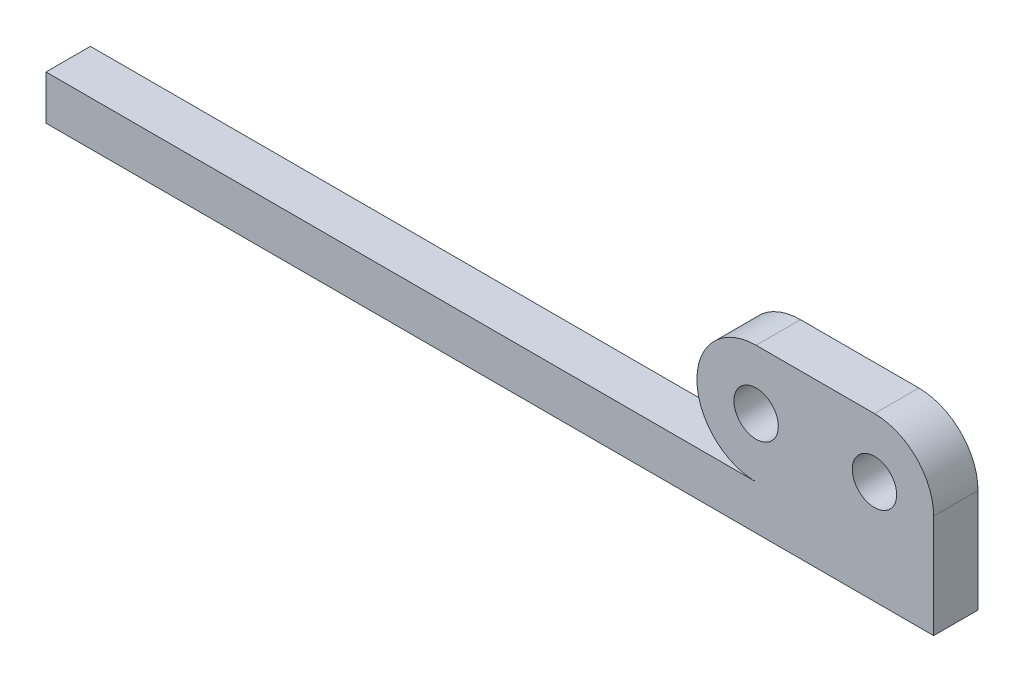
ISO-10303-21;
HEADER;
FILE_DESCRIPTION(('STEP AP214'),'2;1');
FILE_NAME('part.step','',(''),(''),'','','');
FILE_SCHEMA(('AUTOMOTIVE_DESIGN { 1 0 10303 214 1 1 1 1 }'));
ENDSEC;
DATA;
#1=APPLICATION_CONTEXT('core data for automotive mechanical design processes');
#2=APPLICATION_PROTOCOL_DEFINITION('international standard','automotive_design',2000,#1);
#3=PRODUCT_CONTEXT('',#1,'mechanical');
#4=PRODUCT('Part','Part','',(#3));
#5=PRODUCT_RELATED_PRODUCT_CATEGORY('part','',(#4));
#6=PRODUCT_DEFINITION_FORMATION('','',#4);
#7=PRODUCT_DEFINITION_CONTEXT('part definition',#1,'design');
#8=PRODUCT_DEFINITION('design','',#6,#7);
#9=PRODUCT_DEFINITION_SHAPE('','',#8);
#10=(LENGTH_UNIT() NAMED_UNIT(*) SI_UNIT(.MILLI.,.METRE.));
#11=(NAMED_UNIT(*) PLANE_ANGLE_UNIT() SI_UNIT($,.RADIAN.));
#12=(NAMED_UNIT(*) SI_UNIT($,.STERADIAN.) SOLID_ANGLE_UNIT());
#13=UNCERTAINTY_MEASURE_WITH_UNIT(LENGTH_MEASURE(1.E-05),#10,'distance_accuracy_value','');
#14=(GEOMETRIC_REPRESENTATION_CONTEXT(3) GLOBAL_UNCERTAINTY_ASSIGNED_CONTEXT((#13)) GLOBAL_UNIT_ASSIGNED_CONTEXT((#10,
#11,#12)) REPRESENTATION_CONTEXT('',''));
#15=CARTESIAN_POINT('',(0.,0.,0.));
#16=DIRECTION('',(0.,0.,1.));
#17=DIRECTION('',(1.,0.,0.));
#18=AXIS2_PLACEMENT_3D('',#15,#16,#17);
#19=CARTESIAN_POINT('',(0.,4.,3.));
#20=DIRECTION('',(0.,1.,0.));
#21=DIRECTION('',(0.,0.,1.));
#22=AXIS2_PLACEMENT_3D('',#19,#20,#21);
#23=PLANE('',#22);
#24=DIRECTION('',(1.,0.,0.));
#25=VECTOR('',#24,1.);
#26=CARTESIAN_POINT('',(0.,4.,0.));
#27=LINE('',#26,#25);
#28=CARTESIAN_POINT('',(0.,4.,0.));
#29=VERTEX_POINT('',#28);
#30=CARTESIAN_POINT('',(8.,4.,0.));
#31=VERTEX_POINT('',#30);
#32=EDGE_CURVE('E389',#29,#31,#27,.T.);
#33=ORIENTED_EDGE('',*,*,#32,.F.);
#34=DIRECTION('',(0.,0.,-1.));
#35=VECTOR('',#34,1.);
#36=CARTESIAN_POINT('',(0.,4.,3.));
#37=LINE('',#36,#35);
#38=CARTESIAN_POINT('',(0.,4.,3.));
#39=VERTEX_POINT('',#38);
#40=EDGE_CURVE('E273',#39,#29,#37,.T.);
#41=ORIENTED_EDGE('',*,*,#40,.F.);
#42=DIRECTION('',(1.,0.,0.));
#43=VECTOR('',#42,1.);
#44=CARTESIAN_POINT('',(0.,4.,3.));
#45=LINE('',#44,#43);
#46=CARTESIAN_POINT('',(8.,4.,3.));
#47=VERTEX_POINT('',#46);
#48=EDGE_CURVE('E392',#39,#47,#45,.T.);
#49=ORIENTED_EDGE('',*,*,#48,.T.);
#50=DIRECTION('',(0.,0.,-1.));
#51=VECTOR('',#50,1.);
#52=CARTESIAN_POINT('',(8.,4.,3.));
#53=LINE('',#52,#51);
#54=EDGE_CURVE('E12',#47,#31,#53,.T.);
#55=ORIENTED_EDGE('',*,*,#54,.T.);
#56=EDGE_LOOP('',(#33,#41,#49,#55));
#57=FACE_BOUND('',#56,.T.);
#58=ADVANCED_FACE('F263',(#57),#23,.T.);
#59=CARTESIAN_POINT('',(0.,0.,0.));
#60=DIRECTION('',(0.,0.,1.));
#61=DIRECTION('',(1.,0.,0.));
#62=AXIS2_PLACEMENT_3D('',#59,#60,#61);
#63=PLANE('',#62);
#64=CARTESIAN_POINT('',(8.,0.,0.));
#65=DIRECTION('',(0.,0.,1.));
#66=DIRECTION('',(1.,0.,0.));
#67=AXIS2_PLACEMENT_3D('',#64,#65,#66);
#68=CIRCLE('',#67,4.);
#69=CARTESIAN_POINT('',(12.,0.,0.));
#70=VERTEX_POINT('',#69);
#71=EDGE_CURVE('E362',#70,#31,#68,.T.);
#72=ORIENTED_EDGE('',*,*,#71,.F.);
#73=DIRECTION('',(0.,-1.,0.));
#74=VECTOR('',#73,1.);
#75=CARTESIAN_POINT('',(12.,0.,0.));
#76=LINE('',#75,#74);
#77=CARTESIAN_POINT('',(12.,-7.,0.));
#78=VERTEX_POINT('',#77);
#79=EDGE_CURVE('E379',#70,#78,#76,.T.);
#80=ORIENTED_EDGE('',*,*,#79,.T.);
#81=DIRECTION('',(-1.,0.,0.));
#82=VECTOR('',#81,1.);
#83=CARTESIAN_POINT('',(12.,-7.,0.));
#84=LINE('',#83,#82);
#85=CARTESIAN_POINT('',(-48.,-7.,0.));
#86=VERTEX_POINT('',#85);
#87=EDGE_CURVE('E349',#78,#86,#84,.T.);
#88=ORIENTED_EDGE('',*,*,#87,.T.);
#89=DIRECTION('',(0.,-1.,0.));
#90=VECTOR('',#89,1.);
#91=CARTESIAN_POINT('',(-48.,-4.,0.));
#92=LINE('',#91,#90);
#93=CARTESIAN_POINT('',(-48.,-4.,0.));
#94=VERTEX_POINT('',#93);
#95=EDGE_CURVE('E338',#94,#86,#92,.T.);
#96=ORIENTED_EDGE('',*,*,#95,.F.);
#97=DIRECTION('',(-1.,0.,0.));
#98=VECTOR('',#97,1.);
#99=CARTESIAN_POINT('',(12.,-4.,0.));
#100=LINE('',#99,#98);
#101=CARTESIAN_POINT('',(0.,-4.,0.));
#102=VERTEX_POINT('',#101);
#103=EDGE_CURVE('E326',#102,#94,#100,.T.);
#104=ORIENTED_EDGE('',*,*,#103,.F.);
#105=CARTESIAN_POINT('',(0.,0.,0.));
#106=DIRECTION('',(0.,0.,1.));
#107=DIRECTION('',(1.,0.,0.));
#108=AXIS2_PLACEMENT_3D('',#105,#106,#107);
#109=CIRCLE('',#108,4.);
#110=EDGE_CURVE('E374',#29,#102,#109,.T.);
#111=ORIENTED_EDGE('',*,*,#110,.F.);
#112=ORIENTED_EDGE('',*,*,#32,.T.);
#113=EDGE_LOOP('',(#72,#80,#88,#96,#104,#111,#112));
#114=FACE_BOUND('',#113,.T.);
#115=CARTESIAN_POINT('',(0.,0.,0.));
#116=DIRECTION('',(0.,0.,1.));
#117=DIRECTION('',(1.,0.,0.));
#118=AXIS2_PLACEMENT_3D('',#115,#116,#117);
#119=CIRCLE('',#118,1.5);
#120=CARTESIAN_POINT('',(1.5,0.,0.));
#121=VERTEX_POINT('',#120);
#122=EDGE_CURVE('E369',#121,#121,#119,.T.);
#123=ORIENTED_EDGE('',*,*,#122,.T.);
#124=EDGE_LOOP('',(#123));
#125=FACE_BOUND('',#124,.T.);
#126=CARTESIAN_POINT('',(8.,0.,0.));
#127=DIRECTION('',(0.,0.,1.));
#128=DIRECTION('',(1.,0.,0.));
#129=AXIS2_PLACEMENT_3D('',#126,#127,#128);
#130=CIRCLE('',#129,1.5);
#131=CARTESIAN_POINT('',(9.49999999999999,0.,0.));
#132=VERTEX_POINT('',#131);
#133=EDGE_CURVE('E344',#132,#132,#130,.T.);
#134=ORIENTED_EDGE('',*,*,#133,.T.);
#135=EDGE_LOOP('',(#134));
#136=FACE_BOUND('',#135,.T.);
#137=ADVANCED_FACE('F347',(#114,#125,#136),#63,.F.);
#138=CARTESIAN_POINT('',(0.,0.,3.));
#139=DIRECTION('',(0.,0.,1.));
#140=DIRECTION('',(1.,0.,0.));
#141=AXIS2_PLACEMENT_3D('',#138,#139,#140);
#142=PLANE('',#141);
#143=DIRECTION('',(0.,-1.,0.));
#144=VECTOR('',#143,1.);
#145=CARTESIAN_POINT('',(12.,0.,3.));
#146=LINE('',#145,#144);
#147=CARTESIAN_POINT('',(12.,0.,3.));
#148=VERTEX_POINT('',#147);
#149=CARTESIAN_POINT('',(12.,-7.,3.));
#150=VERTEX_POINT('',#149);
#151=EDGE_CURVE('E386',#148,#150,#146,.T.);
#152=ORIENTED_EDGE('',*,*,#151,.F.);
#153=CARTESIAN_POINT('',(8.,0.,3.));
#154=DIRECTION('',(0.,0.,1.));
#155=DIRECTION('',(1.,0.,0.));
#156=AXIS2_PLACEMENT_3D('',#153,#154,#155);
#157=CIRCLE('',#156,4.);
#158=EDGE_CURVE('E365',#148,#47,#157,.T.);
#159=ORIENTED_EDGE('',*,*,#158,.T.);
#160=ORIENTED_EDGE('',*,*,#48,.F.);
#161=CARTESIAN_POINT('',(0.,0.,3.));
#162=DIRECTION('',(0.,0.,1.));
#163=DIRECTION('',(1.,0.,0.));
#164=AXIS2_PLACEMENT_3D('',#161,#162,#163);
#165=CIRCLE('',#164,4.);
#166=CARTESIAN_POINT('',(0.,-4.,3.));
#167=VERTEX_POINT('',#166);
#168=EDGE_CURVE('E376',#39,#167,#165,.T.);
#169=ORIENTED_EDGE('',*,*,#168,.T.);
#170=DIRECTION('',(-1.,0.,0.));
#171=VECTOR('',#170,1.);
#172=CARTESIAN_POINT('',(12.,-4.,3.));
#173=LINE('',#172,#171);
#174=CARTESIAN_POINT('',(-48.,-4.,3.));
#175=VERTEX_POINT('',#174);
#176=EDGE_CURVE('E354',#167,#175,#173,.T.);
#177=ORIENTED_EDGE('',*,*,#176,.T.);
#178=DIRECTION('',(0.,-1.,0.));
#179=VECTOR('',#178,1.);
#180=CARTESIAN_POINT('',(-48.,-4.,3.));
#181=LINE('',#180,#179);
#182=CARTESIAN_POINT('',(-48.,-7.,3.));
#183=VERTEX_POINT('',#182);
#184=EDGE_CURVE('E343',#175,#183,#181,.T.);
#185=ORIENTED_EDGE('',*,*,#184,.T.);
#186=DIRECTION('',(-1.,0.,0.));
#187=VECTOR('',#186,1.);
#188=CARTESIAN_POINT('',(12.,-7.,3.));
#189=LINE('',#188,#187);
#190=EDGE_CURVE('E337',#150,#183,#189,.T.);
#191=ORIENTED_EDGE('',*,*,#190,.F.);
#192=EDGE_LOOP('',(#152,#159,#160,#169,#177,#185,#191));
#193=FACE_BOUND('',#192,.T.);
#194=CARTESIAN_POINT('',(0.,0.,3.));
#195=DIRECTION('',(0.,0.,1.));
#196=DIRECTION('',(1.,0.,0.));
#197=AXIS2_PLACEMENT_3D('',#194,#195,#196);
#198=CIRCLE('',#197,1.5);
#199=CARTESIAN_POINT('',(1.5,0.,3.));
#200=VERTEX_POINT('',#199);
#201=EDGE_CURVE('E377',#200,#200,#198,.T.);
#202=ORIENTED_EDGE('',*,*,#201,.F.);
#203=EDGE_LOOP('',(#202));
#204=FACE_BOUND('',#203,.T.);
#205=CARTESIAN_POINT('',(8.,0.,3.));
#206=DIRECTION('',(0.,0.,1.));
#207=DIRECTION('',(1.,0.,0.));
#208=AXIS2_PLACEMENT_3D('',#205,#206,#207);
#209=CIRCLE('',#208,1.5);
#210=CARTESIAN_POINT('',(9.49999999999999,0.,3.));
#211=VERTEX_POINT('',#210);
#212=EDGE_CURVE('E366',#211,#211,#209,.T.);
#213=ORIENTED_EDGE('',*,*,#212,.F.);
#214=EDGE_LOOP('',(#213));
#215=FACE_BOUND('',#214,.T.);
#216=ADVANCED_FACE('F397',(#193,#204,#215),#142,.T.);
#217=CARTESIAN_POINT('',(12.,-7.,3.));
#218=DIRECTION('',(0.,-1.,0.));
#219=DIRECTION('',(1.,0.,0.));
#220=AXIS2_PLACEMENT_3D('',#217,#218,#219);
#221=PLANE('',#220);
#222=ORIENTED_EDGE('',*,*,#87,.F.);
#223=DIRECTION('',(0.,0.,-1.));
#224=VECTOR('',#223,1.);
#225=CARTESIAN_POINT('',(12.,-7.,3.));
#226=LINE('',#225,#224);
#227=EDGE_CURVE('E267',#150,#78,#226,.T.);
#228=ORIENTED_EDGE('',*,*,#227,.F.);
#229=ORIENTED_EDGE('',*,*,#190,.T.);
#230=DIRECTION('',(0.,0.,-1.));
#231=VECTOR('',#230,1.);
#232=CARTESIAN_POINT('',(-48.,-7.,3.));
#233=LINE('',#232,#231);
#234=EDGE_CURVE('E319',#183,#86,#233,.T.);
#235=ORIENTED_EDGE('',*,*,#234,.T.);
#236=EDGE_LOOP('',(#222,#228,#229,#235));
#237=FACE_BOUND('',#236,.T.);
#238=ADVANCED_FACE('F265',(#237),#221,.T.);
#239=CARTESIAN_POINT('',(-48.,-4.,3.));
#240=DIRECTION('',(1.,0.,0.));
#241=DIRECTION('',(0.,0.,-1.));
#242=AXIS2_PLACEMENT_3D('',#239,#240,#241);
#243=PLANE('',#242);
#244=ORIENTED_EDGE('',*,*,#95,.T.);
#245=ORIENTED_EDGE('',*,*,#234,.F.);
#246=ORIENTED_EDGE('',*,*,#184,.F.);
#247=DIRECTION('',(0.,0.,-1.));
#248=VECTOR('',#247,1.);
#249=CARTESIAN_POINT('',(-48.,-4.,3.));
#250=LINE('',#249,#248);
#251=EDGE_CURVE('E330',#175,#94,#250,.T.);
#252=ORIENTED_EDGE('',*,*,#251,.T.);
#253=EDGE_LOOP('',(#244,#245,#246,#252));
#254=FACE_BOUND('',#253,.T.);
#255=ADVANCED_FACE('F341',(#254),#243,.F.);
#256=CARTESIAN_POINT('',(12.,0.,3.));
#257=DIRECTION('',(1.,0.,0.));
#258=DIRECTION('',(0.,0.,-1.));
#259=AXIS2_PLACEMENT_3D('',#256,#257,#258);
#260=PLANE('',#259);
#261=ORIENTED_EDGE('',*,*,#79,.F.);
#262=DIRECTION('',(0.,0.,-1.));
#263=VECTOR('',#262,1.);
#264=CARTESIAN_POINT('',(12.,0.,3.));
#265=LINE('',#264,#263);
#266=EDGE_CURVE('E384',#148,#70,#265,.T.);
#267=ORIENTED_EDGE('',*,*,#266,.F.);
#268=ORIENTED_EDGE('',*,*,#151,.T.);
#269=ORIENTED_EDGE('',*,*,#227,.T.);
#270=EDGE_LOOP('',(#261,#267,#268,#269));
#271=FACE_BOUND('',#270,.T.);
#272=ADVANCED_FACE('F422',(#271),#260,.T.);
#273=CARTESIAN_POINT('',(12.,-4.,3.));
#274=DIRECTION('',(0.,-1.,0.));
#275=DIRECTION('',(1.,0.,0.));
#276=AXIS2_PLACEMENT_3D('',#273,#274,#275);
#277=PLANE('',#276);
#278=ORIENTED_EDGE('',*,*,#176,.F.);
#279=DIRECTION('',(0.,0.,-1.));
#280=VECTOR('',#279,1.);
#281=CARTESIAN_POINT('',(0.,-4.,3.));
#282=LINE('',#281,#280);
#283=EDGE_CURVE('E333',#167,#102,#282,.T.);
#284=ORIENTED_EDGE('',*,*,#283,.T.);
#285=ORIENTED_EDGE('',*,*,#103,.T.);
#286=ORIENTED_EDGE('',*,*,#251,.F.);
#287=EDGE_LOOP('',(#278,#284,#285,#286));
#288=FACE_BOUND('',#287,.T.);
#289=ADVANCED_FACE('F329',(#288),#277,.F.);
#290=CARTESIAN_POINT('',(8.,0.,3.));
#291=DIRECTION('',(0.,0.,-1.));
#292=DIRECTION('',(-1.,0.,0.));
#293=AXIS2_PLACEMENT_3D('',#290,#291,#292);
#294=CYLINDRICAL_SURFACE('',#293,1.5);
#295=ORIENTED_EDGE('',*,*,#212,.T.);
#296=EDGE_LOOP('',(#295));
#297=FACE_BOUND('',#296,.T.);
#298=ORIENTED_EDGE('',*,*,#133,.F.);
#299=EDGE_LOOP('',(#298));
#300=FACE_BOUND('',#299,.T.);
#301=ADVANCED_FACE('F428',(#297,#300),#294,.F.);
#302=CARTESIAN_POINT('',(8.,0.,3.));
#303=DIRECTION('',(0.,0.,-1.));
#304=DIRECTION('',(-1.,0.,0.));
#305=AXIS2_PLACEMENT_3D('',#302,#303,#304);
#306=CYLINDRICAL_SURFACE('',#305,4.);
#307=ORIENTED_EDGE('',*,*,#71,.T.);
#308=ORIENTED_EDGE('',*,*,#54,.F.);
#309=ORIENTED_EDGE('',*,*,#158,.F.);
#310=ORIENTED_EDGE('',*,*,#266,.T.);
#311=EDGE_LOOP('',(#307,#308,#309,#310));
#312=FACE_BOUND('',#311,.T.);
#313=ADVANCED_FACE('F402',(#312),#306,.T.);
#314=CARTESIAN_POINT('',(0.,0.,3.));
#315=DIRECTION('',(0.,0.,-1.));
#316=DIRECTION('',(-1.,0.,0.));
#317=AXIS2_PLACEMENT_3D('',#314,#315,#316);
#318=CYLINDRICAL_SURFACE('',#317,1.5);
#319=ORIENTED_EDGE('',*,*,#201,.T.);
#320=EDGE_LOOP('',(#319));
#321=FACE_BOUND('',#320,.T.);
#322=ORIENTED_EDGE('',*,*,#122,.F.);
#323=EDGE_LOOP('',(#322));
#324=FACE_BOUND('',#323,.T.);
#325=ADVANCED_FACE('F406',(#321,#324),#318,.F.);
#326=CARTESIAN_POINT('',(0.,0.,3.));
#327=DIRECTION('',(0.,0.,-1.));
#328=DIRECTION('',(-1.,0.,0.));
#329=AXIS2_PLACEMENT_3D('',#326,#327,#328);
#330=CYLINDRICAL_SURFACE('',#329,4.);
#331=ORIENTED_EDGE('',*,*,#168,.F.);
#332=ORIENTED_EDGE('',*,*,#40,.T.);
#333=ORIENTED_EDGE('',*,*,#110,.T.);
#334=ORIENTED_EDGE('',*,*,#283,.F.);
#335=EDGE_LOOP('',(#331,#332,#333,#334));
#336=FACE_BOUND('',#335,.T.);
#337=ADVANCED_FACE('F404',(#336),#330,.T.);
#338=CLOSED_SHELL('',(#58,#137,#216,#238,#255,#272,#289,#301,#313,#325,#337));
#339=MANIFOLD_SOLID_BREP('B2',#338);
#340=ADVANCED_BREP_SHAPE_REPRESENTATION('',(#18,#339),#14);
#341=SHAPE_DEFINITION_REPRESENTATION(#9,#340);
ENDSEC;
END-ISO-10303-21;
